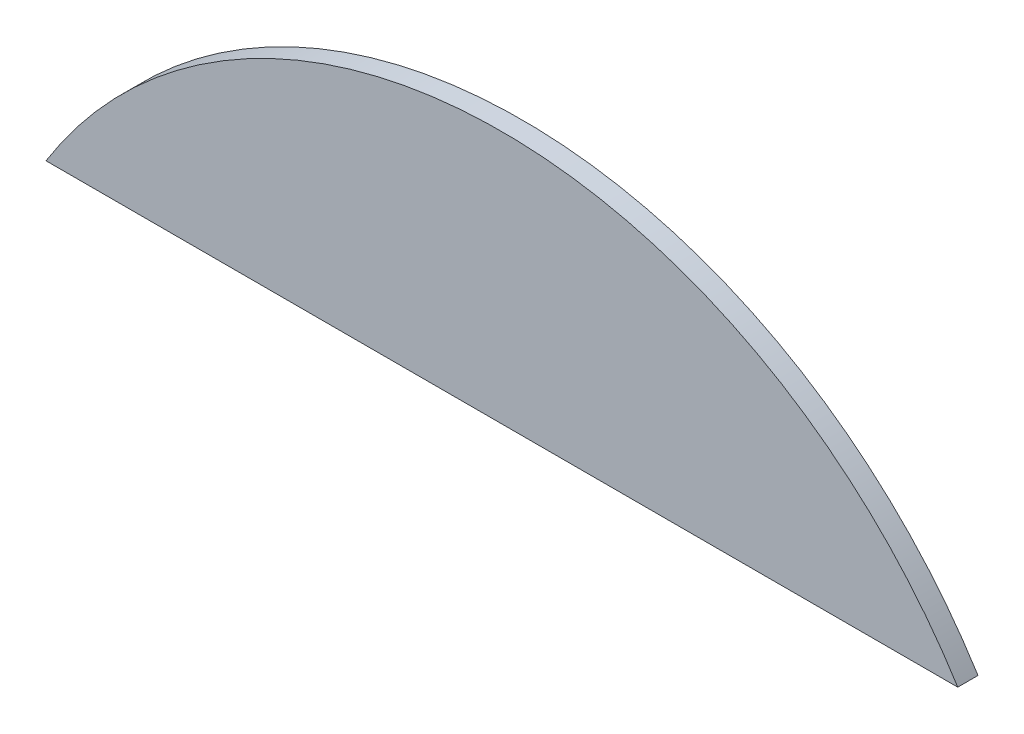
ISO-10303-21;
HEADER;
FILE_DESCRIPTION(('STEP AP214'),'2;1');
FILE_NAME('part.step','',(''),(''),'','','');
FILE_SCHEMA(('AUTOMOTIVE_DESIGN { 1 0 10303 214 1 1 1 1 }'));
ENDSEC;
DATA;
#1=APPLICATION_CONTEXT('core data for automotive mechanical design processes');
#2=APPLICATION_PROTOCOL_DEFINITION('international standard','automotive_design',2000,#1);
#3=PRODUCT_CONTEXT('',#1,'mechanical');
#4=PRODUCT('Part','Part','',(#3));
#5=PRODUCT_RELATED_PRODUCT_CATEGORY('part','',(#4));
#6=PRODUCT_DEFINITION_FORMATION('','',#4);
#7=PRODUCT_DEFINITION_CONTEXT('part definition',#1,'design');
#8=PRODUCT_DEFINITION('design','',#6,#7);
#9=PRODUCT_DEFINITION_SHAPE('','',#8);
#10=(LENGTH_UNIT() NAMED_UNIT(*) SI_UNIT(.MILLI.,.METRE.));
#11=(NAMED_UNIT(*) PLANE_ANGLE_UNIT() SI_UNIT($,.RADIAN.));
#12=(NAMED_UNIT(*) SI_UNIT($,.STERADIAN.) SOLID_ANGLE_UNIT());
#13=UNCERTAINTY_MEASURE_WITH_UNIT(LENGTH_MEASURE(1.E-05),#10,'distance_accuracy_value','');
#14=(GEOMETRIC_REPRESENTATION_CONTEXT(3) GLOBAL_UNCERTAINTY_ASSIGNED_CONTEXT((#13)) GLOBAL_UNIT_ASSIGNED_CONTEXT((#10,
#11,#12)) REPRESENTATION_CONTEXT('',''));
#15=CARTESIAN_POINT('',(0.,0.,0.));
#16=DIRECTION('',(0.,0.,1.));
#17=DIRECTION('',(1.,0.,0.));
#18=AXIS2_PLACEMENT_3D('',#15,#16,#17);
#19=CARTESIAN_POINT('',(0.,-28.,1.));
#20=DIRECTION('',(0.,0.,-1.));
#21=DIRECTION('',(-1.,0.,0.));
#22=AXIS2_PLACEMENT_3D('',#19,#20,#21);
#23=CYLINDRICAL_SURFACE('',#22,53.);
#24=CARTESIAN_POINT('',(0.,-28.,-1.));
#25=DIRECTION('',(0.,0.,1.));
#26=DIRECTION('',(-1.,0.,0.));
#27=AXIS2_PLACEMENT_3D('',#24,#25,#26);
#28=CIRCLE('',#27,53.);
#29=CARTESIAN_POINT('',(45.,0.,-1.));
#30=VERTEX_POINT('',#29);
#31=CARTESIAN_POINT('',(-45.,0.,-1.));
#32=VERTEX_POINT('',#31);
#33=EDGE_CURVE('E65',#30,#32,#28,.T.);
#34=ORIENTED_EDGE('',*,*,#33,.T.);
#35=DIRECTION('',(0.,0.,-1.));
#36=VECTOR('',#35,1.);
#37=CARTESIAN_POINT('',(-45.,0.,1.));
#38=LINE('',#37,#36);
#39=CARTESIAN_POINT('',(-45.,0.,1.));
#40=VERTEX_POINT('',#39);
#41=EDGE_CURVE('E11',#40,#32,#38,.T.);
#42=ORIENTED_EDGE('',*,*,#41,.F.);
#43=CARTESIAN_POINT('',(0.,-28.,1.));
#44=DIRECTION('',(0.,0.,1.));
#45=DIRECTION('',(-1.,0.,0.));
#46=AXIS2_PLACEMENT_3D('',#43,#44,#45);
#47=CIRCLE('',#46,53.);
#48=CARTESIAN_POINT('',(45.,0.,1.));
#49=VERTEX_POINT('',#48);
#50=EDGE_CURVE('E64',#49,#40,#47,.T.);
#51=ORIENTED_EDGE('',*,*,#50,.F.);
#52=DIRECTION('',(0.,0.,-1.));
#53=VECTOR('',#52,1.);
#54=CARTESIAN_POINT('',(45.,0.,1.));
#55=LINE('',#54,#53);
#56=EDGE_CURVE('E42',#49,#30,#55,.T.);
#57=ORIENTED_EDGE('',*,*,#56,.T.);
#58=EDGE_LOOP('',(#34,#42,#51,#57));
#59=FACE_BOUND('',#58,.T.);
#60=ADVANCED_FACE('F34',(#59),#23,.T.);
#61=CARTESIAN_POINT('',(-45.,0.,1.));
#62=DIRECTION('',(0.,1.,0.));
#63=DIRECTION('',(-1.,0.,0.));
#64=AXIS2_PLACEMENT_3D('',#61,#62,#63);
#65=PLANE('',#64);
#66=DIRECTION('',(1.,0.,0.));
#67=VECTOR('',#66,1.);
#68=CARTESIAN_POINT('',(-45.,0.,-1.));
#69=LINE('',#68,#67);
#70=EDGE_CURVE('E57',#32,#30,#69,.T.);
#71=ORIENTED_EDGE('',*,*,#70,.T.);
#72=ORIENTED_EDGE('',*,*,#56,.F.);
#73=DIRECTION('',(1.,0.,0.));
#74=VECTOR('',#73,1.);
#75=CARTESIAN_POINT('',(-45.,0.,1.));
#76=LINE('',#75,#74);
#77=EDGE_CURVE('E49',#40,#49,#76,.T.);
#78=ORIENTED_EDGE('',*,*,#77,.F.);
#79=ORIENTED_EDGE('',*,*,#41,.T.);
#80=EDGE_LOOP('',(#71,#72,#78,#79));
#81=FACE_BOUND('',#80,.T.);
#82=ADVANCED_FACE('F60',(#81),#65,.F.);
#83=CARTESIAN_POINT('',(0.,-28.,1.));
#84=DIRECTION('',(0.,0.,-1.));
#85=DIRECTION('',(-1.,0.,0.));
#86=AXIS2_PLACEMENT_3D('',#83,#84,#85);
#87=PLANE('',#86);
#88=ORIENTED_EDGE('',*,*,#50,.T.);
#89=ORIENTED_EDGE('',*,*,#77,.T.);
#90=EDGE_LOOP('',(#88,#89));
#91=FACE_BOUND('',#90,.T.);
#92=ADVANCED_FACE('F72',(#91),#87,.F.);
#93=CARTESIAN_POINT('',(0.,-28.,-1.));
#94=DIRECTION('',(0.,0.,-1.));
#95=DIRECTION('',(-1.,0.,0.));
#96=AXIS2_PLACEMENT_3D('',#93,#94,#95);
#97=PLANE('',#96);
#98=ORIENTED_EDGE('',*,*,#33,.F.);
#99=ORIENTED_EDGE('',*,*,#70,.F.);
#100=EDGE_LOOP('',(#98,#99));
#101=FACE_BOUND('',#100,.T.);
#102=ADVANCED_FACE('F68',(#101),#97,.T.);
#103=CLOSED_SHELL('',(#60,#82,#92,#102));
#104=MANIFOLD_SOLID_BREP('B2',#103);
#105=ADVANCED_BREP_SHAPE_REPRESENTATION('',(#18,#104),#14);
#106=SHAPE_DEFINITION_REPRESENTATION(#9,#105);
ENDSEC;
END-ISO-10303-21;
